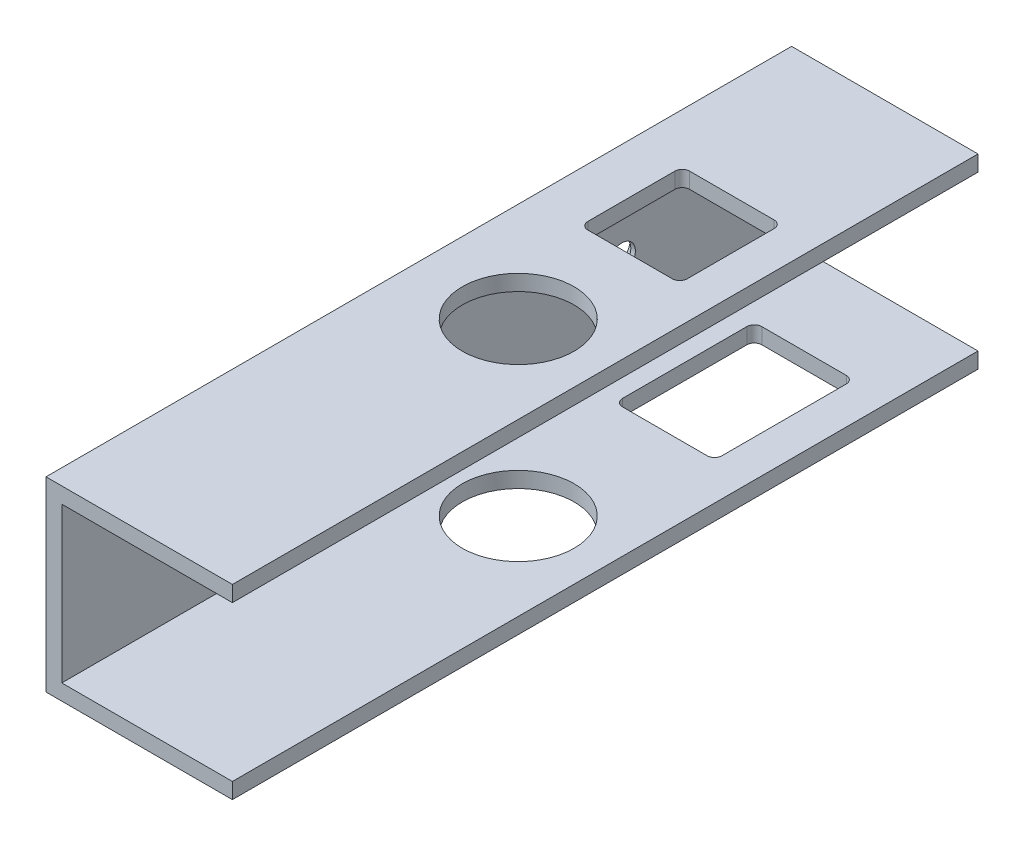
ISO-10303-21;
HEADER;
FILE_DESCRIPTION(('STEP AP214'),'2;1');
FILE_NAME('part.step','',(''),(''),'','','');
FILE_SCHEMA(('AUTOMOTIVE_DESIGN { 1 0 10303 214 1 1 1 1 }'));
ENDSEC;
DATA;
#1=APPLICATION_CONTEXT('core data for automotive mechanical design processes');
#2=APPLICATION_PROTOCOL_DEFINITION('international standard','automotive_design',2000,#1);
#3=PRODUCT_CONTEXT('',#1,'mechanical');
#4=PRODUCT('Part','Part','',(#3));
#5=PRODUCT_RELATED_PRODUCT_CATEGORY('part','',(#4));
#6=PRODUCT_DEFINITION_FORMATION('','',#4);
#7=PRODUCT_DEFINITION_CONTEXT('part definition',#1,'design');
#8=PRODUCT_DEFINITION('design','',#6,#7);
#9=PRODUCT_DEFINITION_SHAPE('','',#8);
#10=(LENGTH_UNIT() NAMED_UNIT(*) SI_UNIT(.MILLI.,.METRE.));
#11=(NAMED_UNIT(*) PLANE_ANGLE_UNIT() SI_UNIT($,.RADIAN.));
#12=(NAMED_UNIT(*) SI_UNIT($,.STERADIAN.) SOLID_ANGLE_UNIT());
#13=UNCERTAINTY_MEASURE_WITH_UNIT(LENGTH_MEASURE(1.E-05),#10,'distance_accuracy_value','');
#14=(GEOMETRIC_REPRESENTATION_CONTEXT(3) GLOBAL_UNCERTAINTY_ASSIGNED_CONTEXT((#13)) GLOBAL_UNIT_ASSIGNED_CONTEXT((#10,
#11,#12)) REPRESENTATION_CONTEXT('',''));
#15=CARTESIAN_POINT('',(0.,0.,0.));
#16=DIRECTION('',(0.,0.,1.));
#17=DIRECTION('',(1.,0.,0.));
#18=AXIS2_PLACEMENT_3D('',#15,#16,#17);
#19=CARTESIAN_POINT('',(75.,-37.5,300.));
#20=DIRECTION('',(0.,1.,0.));
#21=DIRECTION('',(0.,0.,1.));
#22=AXIS2_PLACEMENT_3D('',#19,#20,#21);
#23=PLANE('',#22);
#24=DIRECTION('',(0.,0.,-1.));
#25=VECTOR('',#24,1.);
#26=CARTESIAN_POINT('',(20.,-37.5,91.));
#27=LINE('',#26,#25);
#28=CARTESIAN_POINT('',(20.,-37.5,88.));
#29=VERTEX_POINT('',#28);
#30=CARTESIAN_POINT('',(20.,-37.5,38.));
#31=VERTEX_POINT('',#30);
#32=EDGE_CURVE('E335',#29,#31,#27,.T.);
#33=ORIENTED_EDGE('',*,*,#32,.F.);
#34=CARTESIAN_POINT('',(23.,-37.5,88.));
#35=DIRECTION('',(0.,1.,0.));
#36=DIRECTION('',(0.,0.,1.));
#37=AXIS2_PLACEMENT_3D('',#34,#35,#36);
#38=CIRCLE('',#37,3.);
#39=CARTESIAN_POINT('',(23.,-37.5,91.));
#40=VERTEX_POINT('',#39);
#41=EDGE_CURVE('E286',#29,#40,#38,.T.);
#42=ORIENTED_EDGE('',*,*,#41,.T.);
#43=DIRECTION('',(-1.,0.,0.));
#44=VECTOR('',#43,1.);
#45=CARTESIAN_POINT('',(20.,-37.5,91.));
#46=LINE('',#45,#44);
#47=CARTESIAN_POINT('',(57.,-37.5,91.));
#48=VERTEX_POINT('',#47);
#49=EDGE_CURVE('E332',#48,#40,#46,.T.);
#50=ORIENTED_EDGE('',*,*,#49,.F.);
#51=CARTESIAN_POINT('',(57.,-37.5,88.));
#52=DIRECTION('',(0.,1.,0.));
#53=DIRECTION('',(0.,0.,1.));
#54=AXIS2_PLACEMENT_3D('',#51,#52,#53);
#55=CIRCLE('',#54,3.);
#56=CARTESIAN_POINT('',(60.,-37.5,88.));
#57=VERTEX_POINT('',#56);
#58=EDGE_CURVE('E282',#48,#57,#55,.T.);
#59=ORIENTED_EDGE('',*,*,#58,.T.);
#60=DIRECTION('',(0.,0.,1.));
#61=VECTOR('',#60,1.);
#62=CARTESIAN_POINT('',(60.,-37.5,91.));
#63=LINE('',#62,#61);
#64=CARTESIAN_POINT('',(60.,-37.5,38.));
#65=VERTEX_POINT('',#64);
#66=EDGE_CURVE('E346',#65,#57,#63,.T.);
#67=ORIENTED_EDGE('',*,*,#66,.F.);
#68=CARTESIAN_POINT('',(57.,-37.5,38.));
#69=DIRECTION('',(0.,1.,0.));
#70=DIRECTION('',(0.,0.,1.));
#71=AXIS2_PLACEMENT_3D('',#68,#69,#70);
#72=CIRCLE('',#71,3.);
#73=CARTESIAN_POINT('',(57.,-37.5,35.));
#74=VERTEX_POINT('',#73);
#75=EDGE_CURVE('E278',#65,#74,#72,.T.);
#76=ORIENTED_EDGE('',*,*,#75,.T.);
#77=DIRECTION('',(1.,0.,0.));
#78=VECTOR('',#77,1.);
#79=CARTESIAN_POINT('',(20.,-37.5,35.));
#80=LINE('',#79,#78);
#81=CARTESIAN_POINT('',(23.,-37.5,35.));
#82=VERTEX_POINT('',#81);
#83=EDGE_CURVE('E343',#82,#74,#80,.T.);
#84=ORIENTED_EDGE('',*,*,#83,.F.);
#85=CARTESIAN_POINT('',(23.,-37.5,38.));
#86=DIRECTION('',(0.,1.,0.));
#87=DIRECTION('',(0.,0.,1.));
#88=AXIS2_PLACEMENT_3D('',#85,#86,#87);
#89=CIRCLE('',#88,3.);
#90=EDGE_CURVE('E290',#82,#31,#89,.T.);
#91=ORIENTED_EDGE('',*,*,#90,.T.);
#92=EDGE_LOOP('',(#33,#42,#50,#59,#67,#76,#84,#91));
#93=FACE_BOUND('',#92,.T.);
#94=CARTESIAN_POINT('',(40.,-37.5,150.));
#95=DIRECTION('',(0.,1.,0.));
#96=DIRECTION('',(0.,0.,1.));
#97=AXIS2_PLACEMENT_3D('',#94,#95,#96);
#98=CIRCLE('',#97,22.5);
#99=CARTESIAN_POINT('',(40.,-37.5,172.5));
#100=VERTEX_POINT('',#99);
#101=EDGE_CURVE('E350',#100,#100,#98,.T.);
#102=ORIENTED_EDGE('',*,*,#101,.T.);
#103=EDGE_LOOP('',(#102));
#104=FACE_BOUND('',#103,.T.);
#105=DIRECTION('',(1.,0.,0.));
#106=VECTOR('',#105,1.);
#107=CARTESIAN_POINT('',(75.,-37.5,0.));
#108=LINE('',#107,#106);
#109=CARTESIAN_POINT('',(0.,-37.5,0.));
#110=VERTEX_POINT('',#109);
#111=CARTESIAN_POINT('',(75.,-37.5,0.));
#112=VERTEX_POINT('',#111);
#113=EDGE_CURVE('E221',#110,#112,#108,.T.);
#114=ORIENTED_EDGE('',*,*,#113,.T.);
#115=DIRECTION('',(0.,0.,-1.));
#116=VECTOR('',#115,1.);
#117=CARTESIAN_POINT('',(75.,-37.5,300.));
#118=LINE('',#117,#116);
#119=CARTESIAN_POINT('',(75.,-37.5,300.));
#120=VERTEX_POINT('',#119);
#121=EDGE_CURVE('E202',#120,#112,#118,.T.);
#122=ORIENTED_EDGE('',*,*,#121,.F.);
#123=DIRECTION('',(1.,0.,0.));
#124=VECTOR('',#123,1.);
#125=CARTESIAN_POINT('',(75.,-37.5,300.));
#126=LINE('',#125,#124);
#127=CARTESIAN_POINT('',(0.,-37.5,300.));
#128=VERTEX_POINT('',#127);
#129=EDGE_CURVE('E209',#128,#120,#126,.T.);
#130=ORIENTED_EDGE('',*,*,#129,.F.);
#131=DIRECTION('',(0.,0.,-1.));
#132=VECTOR('',#131,1.);
#133=CARTESIAN_POINT('',(0.,-37.5,300.));
#134=LINE('',#133,#132);
#135=EDGE_CURVE('E371',#128,#110,#134,.T.);
#136=ORIENTED_EDGE('',*,*,#135,.T.);
#137=EDGE_LOOP('',(#114,#122,#130,#136));
#138=FACE_BOUND('',#137,.T.);
#139=ADVANCED_FACE('F35',(#93,#104,#138),#23,.F.);
#140=CARTESIAN_POINT('',(75.,-31.15,300.));
#141=DIRECTION('',(-1.,0.,0.));
#142=DIRECTION('',(0.,-1.,0.));
#143=AXIS2_PLACEMENT_3D('',#140,#141,#142);
#144=PLANE('',#143);
#145=DIRECTION('',(0.,1.,0.));
#146=VECTOR('',#145,1.);
#147=CARTESIAN_POINT('',(75.,-31.15,0.));
#148=LINE('',#147,#146);
#149=CARTESIAN_POINT('',(75.,-31.15,0.));
#150=VERTEX_POINT('',#149);
#151=EDGE_CURVE('E373',#112,#150,#148,.T.);
#152=ORIENTED_EDGE('',*,*,#151,.T.);
#153=DIRECTION('',(0.,0.,-1.));
#154=VECTOR('',#153,1.);
#155=CARTESIAN_POINT('',(75.,-31.15,300.));
#156=LINE('',#155,#154);
#157=CARTESIAN_POINT('',(75.,-31.15,300.));
#158=VERTEX_POINT('',#157);
#159=EDGE_CURVE('E205',#158,#150,#156,.T.);
#160=ORIENTED_EDGE('',*,*,#159,.F.);
#161=DIRECTION('',(0.,1.,0.));
#162=VECTOR('',#161,1.);
#163=CARTESIAN_POINT('',(75.,-31.15,300.));
#164=LINE('',#163,#162);
#165=EDGE_CURVE('E198',#120,#158,#164,.T.);
#166=ORIENTED_EDGE('',*,*,#165,.F.);
#167=ORIENTED_EDGE('',*,*,#121,.T.);
#168=EDGE_LOOP('',(#152,#160,#166,#167));
#169=FACE_BOUND('',#168,.T.);
#170=ADVANCED_FACE('F200',(#169),#144,.F.);
#171=CARTESIAN_POINT('',(6.35000000000001,-31.15,300.));
#172=DIRECTION('',(0.,-1.,0.));
#173=DIRECTION('',(0.,0.,-1.));
#174=AXIS2_PLACEMENT_3D('',#171,#172,#173);
#175=PLANE('',#174);
#176=DIRECTION('',(1.,0.,0.));
#177=VECTOR('',#176,1.);
#178=CARTESIAN_POINT('',(6.35000000000001,-31.15,35.));
#179=LINE('',#178,#177);
#180=CARTESIAN_POINT('',(23.,-31.15,35.));
#181=VERTEX_POINT('',#180);
#182=CARTESIAN_POINT('',(57.,-31.15,35.));
#183=VERTEX_POINT('',#182);
#184=EDGE_CURVE('E225',#181,#183,#179,.T.);
#185=ORIENTED_EDGE('',*,*,#184,.T.);
#186=CARTESIAN_POINT('',(57.,-31.15,38.));
#187=DIRECTION('',(0.,-1.,0.));
#188=DIRECTION('',(0.,0.,-1.));
#189=AXIS2_PLACEMENT_3D('',#186,#187,#188);
#190=CIRCLE('',#189,3.);
#191=CARTESIAN_POINT('',(60.,-31.15,38.));
#192=VERTEX_POINT('',#191);
#193=EDGE_CURVE('E280',#183,#192,#190,.T.);
#194=ORIENTED_EDGE('',*,*,#193,.T.);
#195=DIRECTION('',(0.,0.,1.));
#196=VECTOR('',#195,1.);
#197=CARTESIAN_POINT('',(59.9999999999999,-31.15,300.));
#198=LINE('',#197,#196);
#199=CARTESIAN_POINT('',(60.,-31.15,88.));
#200=VERTEX_POINT('',#199);
#201=EDGE_CURVE('E233',#192,#200,#198,.T.);
#202=ORIENTED_EDGE('',*,*,#201,.T.);
#203=CARTESIAN_POINT('',(57.,-31.15,88.));
#204=DIRECTION('',(0.,-1.,0.));
#205=DIRECTION('',(0.,0.,-1.));
#206=AXIS2_PLACEMENT_3D('',#203,#204,#205);
#207=CIRCLE('',#206,3.);
#208=CARTESIAN_POINT('',(57.,-31.15,91.));
#209=VERTEX_POINT('',#208);
#210=EDGE_CURVE('E284',#200,#209,#207,.T.);
#211=ORIENTED_EDGE('',*,*,#210,.T.);
#212=DIRECTION('',(-1.,0.,0.));
#213=VECTOR('',#212,1.);
#214=CARTESIAN_POINT('',(6.35000000000001,-31.15,91.));
#215=LINE('',#214,#213);
#216=CARTESIAN_POINT('',(23.,-31.15,91.));
#217=VERTEX_POINT('',#216);
#218=EDGE_CURVE('E236',#209,#217,#215,.T.);
#219=ORIENTED_EDGE('',*,*,#218,.T.);
#220=CARTESIAN_POINT('',(23.,-31.15,88.));
#221=DIRECTION('',(0.,-1.,0.));
#222=DIRECTION('',(0.,0.,-1.));
#223=AXIS2_PLACEMENT_3D('',#220,#221,#222);
#224=CIRCLE('',#223,3.);
#225=CARTESIAN_POINT('',(20.,-31.15,88.));
#226=VERTEX_POINT('',#225);
#227=EDGE_CURVE('E288',#217,#226,#224,.T.);
#228=ORIENTED_EDGE('',*,*,#227,.T.);
#229=DIRECTION('',(0.,0.,-1.));
#230=VECTOR('',#229,1.);
#231=CARTESIAN_POINT('',(20.0000000000001,-31.15,300.));
#232=LINE('',#231,#230);
#233=CARTESIAN_POINT('',(20.,-31.15,38.));
#234=VERTEX_POINT('',#233);
#235=EDGE_CURVE('E222',#226,#234,#232,.T.);
#236=ORIENTED_EDGE('',*,*,#235,.T.);
#237=CARTESIAN_POINT('',(23.,-31.15,38.));
#238=DIRECTION('',(0.,-1.,0.));
#239=DIRECTION('',(0.,0.,-1.));
#240=AXIS2_PLACEMENT_3D('',#237,#238,#239);
#241=CIRCLE('',#240,3.);
#242=EDGE_CURVE('E292',#234,#181,#241,.T.);
#243=ORIENTED_EDGE('',*,*,#242,.T.);
#244=EDGE_LOOP('',(#185,#194,#202,#211,#219,#228,#236,#243));
#245=FACE_BOUND('',#244,.T.);
#246=CARTESIAN_POINT('',(40.,-31.15,150.));
#247=DIRECTION('',(0.,-1.,0.));
#248=DIRECTION('',(0.,0.,-1.));
#249=AXIS2_PLACEMENT_3D('',#246,#247,#248);
#250=CIRCLE('',#249,22.5);
#251=CARTESIAN_POINT('',(40.,-31.15,127.5));
#252=VERTEX_POINT('',#251);
#253=EDGE_CURVE('E358',#252,#252,#250,.T.);
#254=ORIENTED_EDGE('',*,*,#253,.T.);
#255=EDGE_LOOP('',(#254));
#256=FACE_BOUND('',#255,.T.);
#257=DIRECTION('',(-1.,0.,0.));
#258=VECTOR('',#257,1.);
#259=CARTESIAN_POINT('',(6.35000000000001,-31.15,0.));
#260=LINE('',#259,#258);
#261=CARTESIAN_POINT('',(6.35000000000001,-31.15,0.));
#262=VERTEX_POINT('',#261);
#263=EDGE_CURVE('E375',#150,#262,#260,.T.);
#264=ORIENTED_EDGE('',*,*,#263,.T.);
#265=DIRECTION('',(0.,0.,-1.));
#266=VECTOR('',#265,1.);
#267=CARTESIAN_POINT('',(6.35000000000001,-31.15,300.));
#268=LINE('',#267,#266);
#269=CARTESIAN_POINT('',(6.35000000000001,-31.15,300.));
#270=VERTEX_POINT('',#269);
#271=EDGE_CURVE('E227',#270,#262,#268,.T.);
#272=ORIENTED_EDGE('',*,*,#271,.F.);
#273=DIRECTION('',(-1.,0.,0.));
#274=VECTOR('',#273,1.);
#275=CARTESIAN_POINT('',(6.35000000000001,-31.15,300.));
#276=LINE('',#275,#274);
#277=EDGE_CURVE('E208',#158,#270,#276,.T.);
#278=ORIENTED_EDGE('',*,*,#277,.F.);
#279=ORIENTED_EDGE('',*,*,#159,.T.);
#280=EDGE_LOOP('',(#264,#272,#278,#279));
#281=FACE_BOUND('',#280,.T.);
#282=ADVANCED_FACE('F421',(#245,#256,#281),#175,.F.);
#283=CARTESIAN_POINT('',(6.35000000000001,31.15,300.));
#284=DIRECTION('',(-1.,0.,0.));
#285=DIRECTION('',(0.,0.,1.));
#286=AXIS2_PLACEMENT_3D('',#283,#284,#285);
#287=PLANE('',#286);
#288=CARTESIAN_POINT('',(6.35000000000001,4.01110333021214,74.7041216047486));
#289=DIRECTION('',(-1.,0.,0.));
#290=DIRECTION('',(0.,0.,1.));
#291=AXIS2_PLACEMENT_3D('',#288,#289,#290);
#292=CIRCLE('',#291,5.49999999999999);
#293=CARTESIAN_POINT('',(6.35000000000001,4.01110333021214,80.2041216047486));
#294=VERTEX_POINT('',#293);
#295=EDGE_CURVE('E39',#294,#294,#292,.T.);
#296=ORIENTED_EDGE('',*,*,#295,.T.);
#297=EDGE_LOOP('',(#296));
#298=FACE_BOUND('',#297,.T.);
#299=DIRECTION('',(0.,1.,0.));
#300=VECTOR('',#299,1.);
#301=CARTESIAN_POINT('',(6.35000000000001,31.15,0.));
#302=LINE('',#301,#300);
#303=CARTESIAN_POINT('',(6.35000000000001,31.15,0.));
#304=VERTEX_POINT('',#303);
#305=EDGE_CURVE('E377',#262,#304,#302,.T.);
#306=ORIENTED_EDGE('',*,*,#305,.T.);
#307=DIRECTION('',(0.,0.,-1.));
#308=VECTOR('',#307,1.);
#309=CARTESIAN_POINT('',(6.35000000000001,31.15,300.));
#310=LINE('',#309,#308);
#311=CARTESIAN_POINT('',(6.35000000000001,31.15,300.));
#312=VERTEX_POINT('',#311);
#313=EDGE_CURVE('E396',#312,#304,#310,.T.);
#314=ORIENTED_EDGE('',*,*,#313,.F.);
#315=DIRECTION('',(0.,1.,0.));
#316=VECTOR('',#315,1.);
#317=CARTESIAN_POINT('',(6.35000000000001,31.15,300.));
#318=LINE('',#317,#316);
#319=EDGE_CURVE('E362',#270,#312,#318,.T.);
#320=ORIENTED_EDGE('',*,*,#319,.F.);
#321=ORIENTED_EDGE('',*,*,#271,.T.);
#322=EDGE_LOOP('',(#306,#314,#320,#321));
#323=FACE_BOUND('',#322,.T.);
#324=ADVANCED_FACE('F403',(#298,#323),#287,.F.);
#325=CARTESIAN_POINT('',(75.,31.15,300.));
#326=DIRECTION('',(0.,1.,0.));
#327=DIRECTION('',(0.,0.,1.));
#328=AXIS2_PLACEMENT_3D('',#325,#326,#327);
#329=PLANE('',#328);
#330=DIRECTION('',(-1.,0.,0.));
#331=VECTOR('',#330,1.);
#332=CARTESIAN_POINT('',(75.,31.15,64.));
#333=LINE('',#332,#331);
#334=CARTESIAN_POINT('',(57.,31.15,64.));
#335=VERTEX_POINT('',#334);
#336=CARTESIAN_POINT('',(23.,31.15,64.));
#337=VERTEX_POINT('',#336);
#338=EDGE_CURVE('E337',#335,#337,#333,.T.);
#339=ORIENTED_EDGE('',*,*,#338,.T.);
#340=CARTESIAN_POINT('',(23.,31.15,67.));
#341=DIRECTION('',(0.,1.,0.));
#342=DIRECTION('',(0.,0.,1.));
#343=AXIS2_PLACEMENT_3D('',#340,#341,#342);
#344=CIRCLE('',#343,3.);
#345=CARTESIAN_POINT('',(20.,31.15,67.));
#346=VERTEX_POINT('',#345);
#347=EDGE_CURVE('E58',#337,#346,#344,.T.);
#348=ORIENTED_EDGE('',*,*,#347,.T.);
#349=DIRECTION('',(0.,0.,1.));
#350=VECTOR('',#349,1.);
#351=CARTESIAN_POINT('',(20.,31.15,300.));
#352=LINE('',#351,#350);
#353=CARTESIAN_POINT('',(20.,31.15,102.));
#354=VERTEX_POINT('',#353);
#355=EDGE_CURVE('E328',#346,#354,#352,.T.);
#356=ORIENTED_EDGE('',*,*,#355,.T.);
#357=CARTESIAN_POINT('',(23.,31.15,102.));
#358=DIRECTION('',(0.,1.,0.));
#359=DIRECTION('',(0.,0.,1.));
#360=AXIS2_PLACEMENT_3D('',#357,#358,#359);
#361=CIRCLE('',#360,3.);
#362=CARTESIAN_POINT('',(23.,31.15,105.));
#363=VERTEX_POINT('',#362);
#364=EDGE_CURVE('E11',#354,#363,#361,.T.);
#365=ORIENTED_EDGE('',*,*,#364,.T.);
#366=DIRECTION('',(1.,0.,0.));
#367=VECTOR('',#366,1.);
#368=CARTESIAN_POINT('',(75.,31.15,105.));
#369=LINE('',#368,#367);
#370=CARTESIAN_POINT('',(57.,31.15,105.));
#371=VERTEX_POINT('',#370);
#372=EDGE_CURVE('E326',#363,#371,#369,.T.);
#373=ORIENTED_EDGE('',*,*,#372,.T.);
#374=CARTESIAN_POINT('',(57.,31.15,102.));
#375=DIRECTION('',(0.,1.,0.));
#376=DIRECTION('',(0.,0.,1.));
#377=AXIS2_PLACEMENT_3D('',#374,#375,#376);
#378=CIRCLE('',#377,3.);
#379=CARTESIAN_POINT('',(60.,31.15,102.));
#380=VERTEX_POINT('',#379);
#381=EDGE_CURVE('E296',#371,#380,#378,.T.);
#382=ORIENTED_EDGE('',*,*,#381,.T.);
#383=DIRECTION('',(0.,0.,-1.));
#384=VECTOR('',#383,1.);
#385=CARTESIAN_POINT('',(60.,31.15,300.));
#386=LINE('',#385,#384);
#387=CARTESIAN_POINT('',(60.,31.15,67.));
#388=VERTEX_POINT('',#387);
#389=EDGE_CURVE('E318',#380,#388,#386,.T.);
#390=ORIENTED_EDGE('',*,*,#389,.T.);
#391=CARTESIAN_POINT('',(57.,31.15,67.));
#392=DIRECTION('',(0.,1.,0.));
#393=DIRECTION('',(0.,0.,1.));
#394=AXIS2_PLACEMENT_3D('',#391,#392,#393);
#395=CIRCLE('',#394,3.);
#396=EDGE_CURVE('E300',#388,#335,#395,.T.);
#397=ORIENTED_EDGE('',*,*,#396,.T.);
#398=EDGE_LOOP('',(#339,#348,#356,#365,#373,#382,#390,#397));
#399=FACE_BOUND('',#398,.T.);
#400=CARTESIAN_POINT('',(40.,31.15,150.));
#401=DIRECTION('',(0.,1.,0.));
#402=DIRECTION('',(0.,0.,1.));
#403=AXIS2_PLACEMENT_3D('',#400,#401,#402);
#404=CIRCLE('',#403,22.5);
#405=CARTESIAN_POINT('',(40.,31.15,172.5));
#406=VERTEX_POINT('',#405);
#407=EDGE_CURVE('E353',#406,#406,#404,.T.);
#408=ORIENTED_EDGE('',*,*,#407,.T.);
#409=EDGE_LOOP('',(#408));
#410=FACE_BOUND('',#409,.T.);
#411=DIRECTION('',(1.,0.,0.));
#412=VECTOR('',#411,1.);
#413=CARTESIAN_POINT('',(75.,31.15,0.));
#414=LINE('',#413,#412);
#415=CARTESIAN_POINT('',(75.,31.15,0.));
#416=VERTEX_POINT('',#415);
#417=EDGE_CURVE('E379',#304,#416,#414,.T.);
#418=ORIENTED_EDGE('',*,*,#417,.T.);
#419=DIRECTION('',(0.,0.,-1.));
#420=VECTOR('',#419,1.);
#421=CARTESIAN_POINT('',(75.,31.15,300.));
#422=LINE('',#421,#420);
#423=CARTESIAN_POINT('',(75.,31.15,300.));
#424=VERTEX_POINT('',#423);
#425=EDGE_CURVE('E393',#424,#416,#422,.T.);
#426=ORIENTED_EDGE('',*,*,#425,.F.);
#427=DIRECTION('',(1.,0.,0.));
#428=VECTOR('',#427,1.);
#429=CARTESIAN_POINT('',(75.,31.15,300.));
#430=LINE('',#429,#428);
#431=EDGE_CURVE('E364',#312,#424,#430,.T.);
#432=ORIENTED_EDGE('',*,*,#431,.F.);
#433=ORIENTED_EDGE('',*,*,#313,.T.);
#434=EDGE_LOOP('',(#418,#426,#432,#433));
#435=FACE_BOUND('',#434,.T.);
#436=ADVANCED_FACE('F324',(#399,#410,#435),#329,.F.);
#437=CARTESIAN_POINT('',(75.,37.5,300.));
#438=DIRECTION('',(-1.,0.,0.));
#439=DIRECTION('',(0.,-1.,0.));
#440=AXIS2_PLACEMENT_3D('',#437,#438,#439);
#441=PLANE('',#440);
#442=DIRECTION('',(0.,1.,0.));
#443=VECTOR('',#442,1.);
#444=CARTESIAN_POINT('',(75.,37.5,0.));
#445=LINE('',#444,#443);
#446=CARTESIAN_POINT('',(75.,37.5,0.));
#447=VERTEX_POINT('',#446);
#448=EDGE_CURVE('E381',#416,#447,#445,.T.);
#449=ORIENTED_EDGE('',*,*,#448,.T.);
#450=DIRECTION('',(0.,0.,-1.));
#451=VECTOR('',#450,1.);
#452=CARTESIAN_POINT('',(75.,37.5,300.));
#453=LINE('',#452,#451);
#454=CARTESIAN_POINT('',(75.,37.5,300.));
#455=VERTEX_POINT('',#454);
#456=EDGE_CURVE('E390',#455,#447,#453,.T.);
#457=ORIENTED_EDGE('',*,*,#456,.F.);
#458=DIRECTION('',(0.,1.,0.));
#459=VECTOR('',#458,1.);
#460=CARTESIAN_POINT('',(75.,37.5,300.));
#461=LINE('',#460,#459);
#462=EDGE_CURVE('E366',#424,#455,#461,.T.);
#463=ORIENTED_EDGE('',*,*,#462,.F.);
#464=ORIENTED_EDGE('',*,*,#425,.T.);
#465=EDGE_LOOP('',(#449,#457,#463,#464));
#466=FACE_BOUND('',#465,.T.);
#467=ADVANCED_FACE('F417',(#466),#441,.F.);
#468=CARTESIAN_POINT('',(0.,37.5,300.));
#469=DIRECTION('',(0.,-1.,0.));
#470=DIRECTION('',(0.,0.,-1.));
#471=AXIS2_PLACEMENT_3D('',#468,#469,#470);
#472=PLANE('',#471);
#473=DIRECTION('',(0.,0.,-1.));
#474=VECTOR('',#473,1.);
#475=CARTESIAN_POINT('',(60.,37.5,105.));
#476=LINE('',#475,#474);
#477=CARTESIAN_POINT('',(60.,37.5,102.));
#478=VERTEX_POINT('',#477);
#479=CARTESIAN_POINT('',(60.,37.5,67.));
#480=VERTEX_POINT('',#479);
#481=EDGE_CURVE('E481',#478,#480,#476,.T.);
#482=ORIENTED_EDGE('',*,*,#481,.F.);
#483=CARTESIAN_POINT('',(57.,37.5,102.));
#484=DIRECTION('',(0.,-1.,0.));
#485=DIRECTION('',(0.,0.,-1.));
#486=AXIS2_PLACEMENT_3D('',#483,#484,#485);
#487=CIRCLE('',#486,3.);
#488=CARTESIAN_POINT('',(57.,37.5,105.));
#489=VERTEX_POINT('',#488);
#490=EDGE_CURVE('E294',#478,#489,#487,.T.);
#491=ORIENTED_EDGE('',*,*,#490,.T.);
#492=DIRECTION('',(1.,0.,0.));
#493=VECTOR('',#492,1.);
#494=CARTESIAN_POINT('',(60.,37.5,105.));
#495=LINE('',#494,#493);
#496=CARTESIAN_POINT('',(23.,37.5,105.));
#497=VERTEX_POINT('',#496);
#498=EDGE_CURVE('E313',#497,#489,#495,.T.);
#499=ORIENTED_EDGE('',*,*,#498,.F.);
#500=CARTESIAN_POINT('',(23.,37.5,102.));
#501=DIRECTION('',(0.,-1.,0.));
#502=DIRECTION('',(0.,0.,-1.));
#503=AXIS2_PLACEMENT_3D('',#500,#501,#502);
#504=CIRCLE('',#503,3.);
#505=CARTESIAN_POINT('',(20.,37.5,102.));
#506=VERTEX_POINT('',#505);
#507=EDGE_CURVE('E44',#497,#506,#504,.T.);
#508=ORIENTED_EDGE('',*,*,#507,.T.);
#509=DIRECTION('',(0.,0.,1.));
#510=VECTOR('',#509,1.);
#511=CARTESIAN_POINT('',(20.,37.5,105.));
#512=LINE('',#511,#510);
#513=CARTESIAN_POINT('',(20.,37.5,67.));
#514=VERTEX_POINT('',#513);
#515=EDGE_CURVE('E311',#514,#506,#512,.T.);
#516=ORIENTED_EDGE('',*,*,#515,.F.);
#517=CARTESIAN_POINT('',(23.,37.5,67.));
#518=DIRECTION('',(0.,-1.,0.));
#519=DIRECTION('',(0.,0.,-1.));
#520=AXIS2_PLACEMENT_3D('',#517,#518,#519);
#521=CIRCLE('',#520,3.);
#522=CARTESIAN_POINT('',(23.,37.5,64.));
#523=VERTEX_POINT('',#522);
#524=EDGE_CURVE('E302',#514,#523,#521,.T.);
#525=ORIENTED_EDGE('',*,*,#524,.T.);
#526=DIRECTION('',(-1.,0.,0.));
#527=VECTOR('',#526,1.);
#528=CARTESIAN_POINT('',(60.,37.5,64.));
#529=LINE('',#528,#527);
#530=CARTESIAN_POINT('',(57.,37.5,64.));
#531=VERTEX_POINT('',#530);
#532=EDGE_CURVE('E319',#531,#523,#529,.T.);
#533=ORIENTED_EDGE('',*,*,#532,.F.);
#534=CARTESIAN_POINT('',(57.,37.5,67.));
#535=DIRECTION('',(0.,-1.,0.));
#536=DIRECTION('',(0.,0.,-1.));
#537=AXIS2_PLACEMENT_3D('',#534,#535,#536);
#538=CIRCLE('',#537,3.);
#539=EDGE_CURVE('E298',#531,#480,#538,.T.);
#540=ORIENTED_EDGE('',*,*,#539,.T.);
#541=EDGE_LOOP('',(#482,#491,#499,#508,#516,#525,#533,#540));
#542=FACE_BOUND('',#541,.T.);
#543=CARTESIAN_POINT('',(40.,37.5,150.));
#544=DIRECTION('',(0.,1.,0.));
#545=DIRECTION('',(0.,0.,1.));
#546=AXIS2_PLACEMENT_3D('',#543,#544,#545);
#547=CIRCLE('',#546,22.5);
#548=CARTESIAN_POINT('',(40.,37.5,172.5));
#549=VERTEX_POINT('',#548);
#550=EDGE_CURVE('E349',#549,#549,#547,.T.);
#551=ORIENTED_EDGE('',*,*,#550,.F.);
#552=EDGE_LOOP('',(#551));
#553=FACE_BOUND('',#552,.T.);
#554=DIRECTION('',(-1.,0.,0.));
#555=VECTOR('',#554,1.);
#556=CARTESIAN_POINT('',(0.,37.5,0.));
#557=LINE('',#556,#555);
#558=CARTESIAN_POINT('',(0.,37.5,0.));
#559=VERTEX_POINT('',#558);
#560=EDGE_CURVE('E383',#447,#559,#557,.T.);
#561=ORIENTED_EDGE('',*,*,#560,.T.);
#562=DIRECTION('',(0.,0.,-1.));
#563=VECTOR('',#562,1.);
#564=CARTESIAN_POINT('',(0.,37.5,300.));
#565=LINE('',#564,#563);
#566=CARTESIAN_POINT('',(0.,37.5,300.));
#567=VERTEX_POINT('',#566);
#568=EDGE_CURVE('E387',#567,#559,#565,.T.);
#569=ORIENTED_EDGE('',*,*,#568,.F.);
#570=DIRECTION('',(-1.,0.,0.));
#571=VECTOR('',#570,1.);
#572=CARTESIAN_POINT('',(0.,37.5,300.));
#573=LINE('',#572,#571);
#574=EDGE_CURVE('E368',#455,#567,#573,.T.);
#575=ORIENTED_EDGE('',*,*,#574,.F.);
#576=ORIENTED_EDGE('',*,*,#456,.T.);
#577=EDGE_LOOP('',(#561,#569,#575,#576));
#578=FACE_BOUND('',#577,.T.);
#579=ADVANCED_FACE('F309',(#542,#553,#578),#472,.F.);
#580=CARTESIAN_POINT('',(0.,-37.5,300.));
#581=DIRECTION('',(1.,0.,0.));
#582=DIRECTION('',(0.,0.,-1.));
#583=AXIS2_PLACEMENT_3D('',#580,#581,#582);
#584=PLANE('',#583);
#585=CARTESIAN_POINT('',(0.,4.01110333021214,74.7041216047486));
#586=DIRECTION('',(-1.,0.,0.));
#587=DIRECTION('',(0.,0.,1.));
#588=AXIS2_PLACEMENT_3D('',#585,#586,#587);
#589=CIRCLE('',#588,10.);
#590=CARTESIAN_POINT('',(0.,4.01110333021214,84.7041216047486));
#591=VERTEX_POINT('',#590);
#592=EDGE_CURVE('E498',#591,#591,#589,.T.);
#593=ORIENTED_EDGE('',*,*,#592,.F.);
#594=EDGE_LOOP('',(#593));
#595=FACE_BOUND('',#594,.T.);
#596=DIRECTION('',(0.,-1.,0.));
#597=VECTOR('',#596,1.);
#598=CARTESIAN_POINT('',(0.,-37.5,0.));
#599=LINE('',#598,#597);
#600=EDGE_CURVE('E218',#559,#110,#599,.T.);
#601=ORIENTED_EDGE('',*,*,#600,.T.);
#602=ORIENTED_EDGE('',*,*,#135,.F.);
#603=DIRECTION('',(0.,-1.,0.));
#604=VECTOR('',#603,1.);
#605=CARTESIAN_POINT('',(0.,-37.5,300.));
#606=LINE('',#605,#604);
#607=EDGE_CURVE('E214',#567,#128,#606,.T.);
#608=ORIENTED_EDGE('',*,*,#607,.F.);
#609=ORIENTED_EDGE('',*,*,#568,.T.);
#610=EDGE_LOOP('',(#601,#602,#608,#609));
#611=FACE_BOUND('',#610,.T.);
#612=ADVANCED_FACE('F504',(#595,#611),#584,.F.);
#613=CARTESIAN_POINT('',(0.,0.,300.));
#614=DIRECTION('',(0.,0.,-1.));
#615=DIRECTION('',(-1.,0.,0.));
#616=AXIS2_PLACEMENT_3D('',#613,#614,#615);
#617=PLANE('',#616);
#618=ORIENTED_EDGE('',*,*,#129,.T.);
#619=ORIENTED_EDGE('',*,*,#165,.T.);
#620=ORIENTED_EDGE('',*,*,#277,.T.);
#621=ORIENTED_EDGE('',*,*,#319,.T.);
#622=ORIENTED_EDGE('',*,*,#431,.T.);
#623=ORIENTED_EDGE('',*,*,#462,.T.);
#624=ORIENTED_EDGE('',*,*,#574,.T.);
#625=ORIENTED_EDGE('',*,*,#607,.T.);
#626=EDGE_LOOP('',(#618,#619,#620,#621,#622,#623,#624,#625));
#627=FACE_BOUND('',#626,.T.);
#628=ADVANCED_FACE('F212',(#627),#617,.F.);
#629=CARTESIAN_POINT('',(0.,0.,0.));
#630=DIRECTION('',(0.,0.,-1.));
#631=DIRECTION('',(-1.,0.,0.));
#632=AXIS2_PLACEMENT_3D('',#629,#630,#631);
#633=PLANE('',#632);
#634=ORIENTED_EDGE('',*,*,#113,.F.);
#635=ORIENTED_EDGE('',*,*,#600,.F.);
#636=ORIENTED_EDGE('',*,*,#560,.F.);
#637=ORIENTED_EDGE('',*,*,#448,.F.);
#638=ORIENTED_EDGE('',*,*,#417,.F.);
#639=ORIENTED_EDGE('',*,*,#305,.F.);
#640=ORIENTED_EDGE('',*,*,#263,.F.);
#641=ORIENTED_EDGE('',*,*,#151,.F.);
#642=EDGE_LOOP('',(#634,#635,#636,#637,#638,#639,#640,#641));
#643=FACE_BOUND('',#642,.T.);
#644=ADVANCED_FACE('F409',(#643),#633,.T.);
#645=CARTESIAN_POINT('',(40.,-37.5,150.));
#646=DIRECTION('',(0.,1.,0.));
#647=DIRECTION('',(0.,0.,1.));
#648=AXIS2_PLACEMENT_3D('',#645,#646,#647);
#649=CYLINDRICAL_SURFACE('',#648,22.5);
#650=ORIENTED_EDGE('',*,*,#550,.T.);
#651=EDGE_LOOP('',(#650));
#652=FACE_BOUND('',#651,.T.);
#653=ORIENTED_EDGE('',*,*,#407,.F.);
#654=EDGE_LOOP('',(#653));
#655=FACE_BOUND('',#654,.T.);
#656=ADVANCED_FACE('F554',(#652,#655),#649,.F.);
#657=ORIENTED_EDGE('',*,*,#101,.F.);
#658=EDGE_LOOP('',(#657));
#659=FACE_BOUND('',#658,.T.);
#660=ORIENTED_EDGE('',*,*,#253,.F.);
#661=EDGE_LOOP('',(#660));
#662=FACE_BOUND('',#661,.T.);
#663=ADVANCED_FACE('F560',(#659,#662),#649,.F.);
#664=CARTESIAN_POINT('',(20.,-27.5,91.));
#665=DIRECTION('',(0.,0.,1.));
#666=DIRECTION('',(1.,0.,0.));
#667=AXIS2_PLACEMENT_3D('',#664,#665,#666);
#668=PLANE('',#667);
#669=ORIENTED_EDGE('',*,*,#218,.F.);
#670=DIRECTION('',(0.,-1.,0.));
#671=VECTOR('',#670,1.);
#672=CARTESIAN_POINT('',(57.,-37.5,91.));
#673=LINE('',#672,#671);
#674=EDGE_CURVE('E251',#209,#48,#673,.T.);
#675=ORIENTED_EDGE('',*,*,#674,.T.);
#676=ORIENTED_EDGE('',*,*,#49,.T.);
#677=DIRECTION('',(0.,-1.,0.));
#678=VECTOR('',#677,1.);
#679=CARTESIAN_POINT('',(23.,-31.15,91.));
#680=LINE('',#679,#678);
#681=EDGE_CURVE('E249',#40,#217,#680,.F.);
#682=ORIENTED_EDGE('',*,*,#681,.T.);
#683=EDGE_LOOP('',(#669,#675,#676,#682));
#684=FACE_BOUND('',#683,.T.);
#685=ADVANCED_FACE('F567',(#684),#668,.F.);
#686=CARTESIAN_POINT('',(60.,-27.5,91.));
#687=DIRECTION('',(1.,0.,0.));
#688=DIRECTION('',(0.,0.,-1.));
#689=AXIS2_PLACEMENT_3D('',#686,#687,#688);
#690=PLANE('',#689);
#691=ORIENTED_EDGE('',*,*,#201,.F.);
#692=DIRECTION('',(0.,-1.,0.));
#693=VECTOR('',#692,1.);
#694=CARTESIAN_POINT('',(60.,-37.5,38.));
#695=LINE('',#694,#693);
#696=EDGE_CURVE('E241',#192,#65,#695,.T.);
#697=ORIENTED_EDGE('',*,*,#696,.T.);
#698=ORIENTED_EDGE('',*,*,#66,.T.);
#699=DIRECTION('',(0.,-1.,0.));
#700=VECTOR('',#699,1.);
#701=CARTESIAN_POINT('',(60.,-31.15,88.));
#702=LINE('',#701,#700);
#703=EDGE_CURVE('E239',#57,#200,#702,.F.);
#704=ORIENTED_EDGE('',*,*,#703,.T.);
#705=EDGE_LOOP('',(#691,#697,#698,#704));
#706=FACE_BOUND('',#705,.T.);
#707=ADVANCED_FACE('F573',(#706),#690,.F.);
#708=CARTESIAN_POINT('',(20.,-27.5,35.));
#709=DIRECTION('',(0.,0.,-1.));
#710=DIRECTION('',(-1.,0.,0.));
#711=AXIS2_PLACEMENT_3D('',#708,#709,#710);
#712=PLANE('',#711);
#713=ORIENTED_EDGE('',*,*,#83,.T.);
#714=DIRECTION('',(0.,-1.,0.));
#715=VECTOR('',#714,1.);
#716=CARTESIAN_POINT('',(57.,-31.15,35.));
#717=LINE('',#716,#715);
#718=EDGE_CURVE('E247',#74,#183,#717,.F.);
#719=ORIENTED_EDGE('',*,*,#718,.T.);
#720=ORIENTED_EDGE('',*,*,#184,.F.);
#721=DIRECTION('',(0.,-1.,0.));
#722=VECTOR('',#721,1.);
#723=CARTESIAN_POINT('',(23.,-37.5,35.));
#724=LINE('',#723,#722);
#725=EDGE_CURVE('E244',#181,#82,#724,.T.);
#726=ORIENTED_EDGE('',*,*,#725,.T.);
#727=EDGE_LOOP('',(#713,#719,#720,#726));
#728=FACE_BOUND('',#727,.T.);
#729=ADVANCED_FACE('F581',(#728),#712,.F.);
#730=CARTESIAN_POINT('',(20.,-27.5,91.));
#731=DIRECTION('',(-1.,0.,0.));
#732=DIRECTION('',(0.,0.,1.));
#733=AXIS2_PLACEMENT_3D('',#730,#731,#732);
#734=PLANE('',#733);
#735=ORIENTED_EDGE('',*,*,#235,.F.);
#736=DIRECTION('',(0.,-1.,0.));
#737=VECTOR('',#736,1.);
#738=CARTESIAN_POINT('',(20.,-37.5,88.));
#739=LINE('',#738,#737);
#740=EDGE_CURVE('E256',#226,#29,#739,.T.);
#741=ORIENTED_EDGE('',*,*,#740,.T.);
#742=ORIENTED_EDGE('',*,*,#32,.T.);
#743=DIRECTION('',(0.,-1.,0.));
#744=VECTOR('',#743,1.);
#745=CARTESIAN_POINT('',(20.,-31.15,38.));
#746=LINE('',#745,#744);
#747=EDGE_CURVE('E254',#31,#234,#746,.F.);
#748=ORIENTED_EDGE('',*,*,#747,.T.);
#749=EDGE_LOOP('',(#735,#741,#742,#748));
#750=FACE_BOUND('',#749,.T.);
#751=ADVANCED_FACE('F589',(#750),#734,.F.);
#752=CARTESIAN_POINT('',(60.,27.5,105.));
#753=DIRECTION('',(0.,0.,1.));
#754=DIRECTION('',(1.,0.,0.));
#755=AXIS2_PLACEMENT_3D('',#752,#753,#754);
#756=PLANE('',#755);
#757=ORIENTED_EDGE('',*,*,#498,.T.);
#758=DIRECTION('',(0.,1.,0.));
#759=VECTOR('',#758,1.);
#760=CARTESIAN_POINT('',(57.,31.15,105.));
#761=LINE('',#760,#759);
#762=EDGE_CURVE('E267',#489,#371,#761,.F.);
#763=ORIENTED_EDGE('',*,*,#762,.T.);
#764=ORIENTED_EDGE('',*,*,#372,.F.);
#765=DIRECTION('',(0.,1.,0.));
#766=VECTOR('',#765,1.);
#767=CARTESIAN_POINT('',(23.,37.5,105.));
#768=LINE('',#767,#766);
#769=EDGE_CURVE('E264',#363,#497,#768,.T.);
#770=ORIENTED_EDGE('',*,*,#769,.T.);
#771=EDGE_LOOP('',(#757,#763,#764,#770));
#772=FACE_BOUND('',#771,.T.);
#773=ADVANCED_FACE('F330',(#772),#756,.F.);
#774=CARTESIAN_POINT('',(20.,27.5,105.));
#775=DIRECTION('',(-1.,0.,0.));
#776=DIRECTION('',(0.,0.,1.));
#777=AXIS2_PLACEMENT_3D('',#774,#775,#776);
#778=PLANE('',#777);
#779=ORIENTED_EDGE('',*,*,#355,.F.);
#780=DIRECTION('',(0.,1.,0.));
#781=VECTOR('',#780,1.);
#782=CARTESIAN_POINT('',(20.,37.5,67.));
#783=LINE('',#782,#781);
#784=EDGE_CURVE('E275',#346,#514,#783,.T.);
#785=ORIENTED_EDGE('',*,*,#784,.T.);
#786=ORIENTED_EDGE('',*,*,#515,.T.);
#787=DIRECTION('',(0.,1.,0.));
#788=VECTOR('',#787,1.);
#789=CARTESIAN_POINT('',(20.,31.15,102.));
#790=LINE('',#789,#788);
#791=EDGE_CURVE('E51',#506,#354,#790,.F.);
#792=ORIENTED_EDGE('',*,*,#791,.T.);
#793=EDGE_LOOP('',(#779,#785,#786,#792));
#794=FACE_BOUND('',#793,.T.);
#795=ADVANCED_FACE('F316',(#794),#778,.F.);
#796=CARTESIAN_POINT('',(60.,27.5,64.));
#797=DIRECTION('',(0.,0.,-1.));
#798=DIRECTION('',(-1.,0.,0.));
#799=AXIS2_PLACEMENT_3D('',#796,#797,#798);
#800=PLANE('',#799);
#801=ORIENTED_EDGE('',*,*,#338,.F.);
#802=DIRECTION('',(0.,1.,0.));
#803=VECTOR('',#802,1.);
#804=CARTESIAN_POINT('',(57.,37.5,64.));
#805=LINE('',#804,#803);
#806=EDGE_CURVE('E271',#335,#531,#805,.T.);
#807=ORIENTED_EDGE('',*,*,#806,.T.);
#808=ORIENTED_EDGE('',*,*,#532,.T.);
#809=DIRECTION('',(0.,1.,0.));
#810=VECTOR('',#809,1.);
#811=CARTESIAN_POINT('',(23.,31.15,64.));
#812=LINE('',#811,#810);
#813=EDGE_CURVE('E269',#523,#337,#812,.F.);
#814=ORIENTED_EDGE('',*,*,#813,.T.);
#815=EDGE_LOOP('',(#801,#807,#808,#814));
#816=FACE_BOUND('',#815,.T.);
#817=ADVANCED_FACE('F479',(#816),#800,.F.);
#818=CARTESIAN_POINT('',(60.,27.5,105.));
#819=DIRECTION('',(1.,0.,0.));
#820=DIRECTION('',(0.,0.,-1.));
#821=AXIS2_PLACEMENT_3D('',#818,#819,#820);
#822=PLANE('',#821);
#823=ORIENTED_EDGE('',*,*,#389,.F.);
#824=DIRECTION('',(0.,1.,0.));
#825=VECTOR('',#824,1.);
#826=CARTESIAN_POINT('',(60.,37.5,102.));
#827=LINE('',#826,#825);
#828=EDGE_CURVE('E261',#380,#478,#827,.T.);
#829=ORIENTED_EDGE('',*,*,#828,.T.);
#830=ORIENTED_EDGE('',*,*,#481,.T.);
#831=DIRECTION('',(0.,1.,0.));
#832=VECTOR('',#831,1.);
#833=CARTESIAN_POINT('',(60.,31.15,67.));
#834=LINE('',#833,#832);
#835=EDGE_CURVE('E259',#480,#388,#834,.F.);
#836=ORIENTED_EDGE('',*,*,#835,.T.);
#837=EDGE_LOOP('',(#823,#829,#830,#836));
#838=FACE_BOUND('',#837,.T.);
#839=ADVANCED_FACE('F447',(#838),#822,.F.);
#840=CARTESIAN_POINT('',(57.,-27.5,38.));
#841=DIRECTION('',(0.,1.,0.));
#842=DIRECTION('',(0.,0.,1.));
#843=AXIS2_PLACEMENT_3D('',#840,#841,#842);
#844=CYLINDRICAL_SURFACE('',#843,3.);
#845=ORIENTED_EDGE('',*,*,#193,.F.);
#846=ORIENTED_EDGE('',*,*,#718,.F.);
#847=ORIENTED_EDGE('',*,*,#75,.F.);
#848=ORIENTED_EDGE('',*,*,#696,.F.);
#849=EDGE_LOOP('',(#845,#846,#847,#848));
#850=FACE_BOUND('',#849,.T.);
#851=ADVANCED_FACE('F443',(#850),#844,.F.);
#852=CARTESIAN_POINT('',(57.,-27.5,88.));
#853=DIRECTION('',(0.,1.,0.));
#854=DIRECTION('',(0.,0.,1.));
#855=AXIS2_PLACEMENT_3D('',#852,#853,#854);
#856=CYLINDRICAL_SURFACE('',#855,3.);
#857=ORIENTED_EDGE('',*,*,#210,.F.);
#858=ORIENTED_EDGE('',*,*,#703,.F.);
#859=ORIENTED_EDGE('',*,*,#58,.F.);
#860=ORIENTED_EDGE('',*,*,#674,.F.);
#861=EDGE_LOOP('',(#857,#858,#859,#860));
#862=FACE_BOUND('',#861,.T.);
#863=ADVANCED_FACE('F446',(#862),#856,.F.);
#864=CARTESIAN_POINT('',(23.,-27.5,88.));
#865=DIRECTION('',(0.,1.,0.));
#866=DIRECTION('',(0.,0.,1.));
#867=AXIS2_PLACEMENT_3D('',#864,#865,#866);
#868=CYLINDRICAL_SURFACE('',#867,3.);
#869=ORIENTED_EDGE('',*,*,#227,.F.);
#870=ORIENTED_EDGE('',*,*,#681,.F.);
#871=ORIENTED_EDGE('',*,*,#41,.F.);
#872=ORIENTED_EDGE('',*,*,#740,.F.);
#873=EDGE_LOOP('',(#869,#870,#871,#872));
#874=FACE_BOUND('',#873,.T.);
#875=ADVANCED_FACE('F451',(#874),#868,.F.);
#876=CARTESIAN_POINT('',(23.,-27.5,38.));
#877=DIRECTION('',(0.,1.,0.));
#878=DIRECTION('',(0.,0.,1.));
#879=AXIS2_PLACEMENT_3D('',#876,#877,#878);
#880=CYLINDRICAL_SURFACE('',#879,3.);
#881=ORIENTED_EDGE('',*,*,#242,.F.);
#882=ORIENTED_EDGE('',*,*,#747,.F.);
#883=ORIENTED_EDGE('',*,*,#90,.F.);
#884=ORIENTED_EDGE('',*,*,#725,.F.);
#885=EDGE_LOOP('',(#881,#882,#883,#884));
#886=FACE_BOUND('',#885,.T.);
#887=ADVANCED_FACE('F455',(#886),#880,.F.);
#888=CARTESIAN_POINT('',(57.,27.5,102.));
#889=DIRECTION('',(0.,-1.,0.));
#890=DIRECTION('',(0.,0.,-1.));
#891=AXIS2_PLACEMENT_3D('',#888,#889,#890);
#892=CYLINDRICAL_SURFACE('',#891,3.);
#893=ORIENTED_EDGE('',*,*,#381,.F.);
#894=ORIENTED_EDGE('',*,*,#762,.F.);
#895=ORIENTED_EDGE('',*,*,#490,.F.);
#896=ORIENTED_EDGE('',*,*,#828,.F.);
#897=EDGE_LOOP('',(#893,#894,#895,#896));
#898=FACE_BOUND('',#897,.T.);
#899=ADVANCED_FACE('F459',(#898),#892,.F.);
#900=CARTESIAN_POINT('',(57.,27.5,67.));
#901=DIRECTION('',(0.,-1.,0.));
#902=DIRECTION('',(0.,0.,-1.));
#903=AXIS2_PLACEMENT_3D('',#900,#901,#902);
#904=CYLINDRICAL_SURFACE('',#903,3.);
#905=ORIENTED_EDGE('',*,*,#396,.F.);
#906=ORIENTED_EDGE('',*,*,#835,.F.);
#907=ORIENTED_EDGE('',*,*,#539,.F.);
#908=ORIENTED_EDGE('',*,*,#806,.F.);
#909=EDGE_LOOP('',(#905,#906,#907,#908));
#910=FACE_BOUND('',#909,.T.);
#911=ADVANCED_FACE('F463',(#910),#904,.F.);
#912=CARTESIAN_POINT('',(23.,27.5,67.));
#913=DIRECTION('',(0.,-1.,0.));
#914=DIRECTION('',(0.,0.,-1.));
#915=AXIS2_PLACEMENT_3D('',#912,#913,#914);
#916=CYLINDRICAL_SURFACE('',#915,3.);
#917=ORIENTED_EDGE('',*,*,#347,.F.);
#918=ORIENTED_EDGE('',*,*,#813,.F.);
#919=ORIENTED_EDGE('',*,*,#524,.F.);
#920=ORIENTED_EDGE('',*,*,#784,.F.);
#921=EDGE_LOOP('',(#917,#918,#919,#920));
#922=FACE_BOUND('',#921,.T.);
#923=ADVANCED_FACE('F466',(#922),#916,.F.);
#924=CARTESIAN_POINT('',(23.,27.5,102.));
#925=DIRECTION('',(0.,-1.,0.));
#926=DIRECTION('',(0.,0.,-1.));
#927=AXIS2_PLACEMENT_3D('',#924,#925,#926);
#928=CYLINDRICAL_SURFACE('',#927,3.);
#929=ORIENTED_EDGE('',*,*,#364,.F.);
#930=ORIENTED_EDGE('',*,*,#791,.F.);
#931=ORIENTED_EDGE('',*,*,#507,.F.);
#932=ORIENTED_EDGE('',*,*,#769,.F.);
#933=EDGE_LOOP('',(#929,#930,#931,#932));
#934=FACE_BOUND('',#933,.T.);
#935=ADVANCED_FACE('F37',(#934),#928,.F.);
#936=CARTESIAN_POINT('',(0.,4.01110333021214,74.7041216047486));
#937=DIRECTION('',(-1.,0.,0.));
#938=DIRECTION('',(0.,0.,1.));
#939=AXIS2_PLACEMENT_3D('',#936,#937,#938);
#940=CYLINDRICAL_SURFACE('',#939,5.49999999999999);
#941=CARTESIAN_POINT('',(4.5,4.01110333021214,74.7041216047486));
#942=DIRECTION('',(-1.,0.,0.));
#943=DIRECTION('',(0.,0.,1.));
#944=AXIS2_PLACEMENT_3D('',#941,#942,#943);
#945=CIRCLE('',#944,5.5);
#946=CARTESIAN_POINT('',(4.5,4.01110333021214,80.2041216047486));
#947=VERTEX_POINT('',#946);
#948=EDGE_CURVE('E494',#947,#947,#945,.T.);
#949=ORIENTED_EDGE('',*,*,#948,.T.);
#950=EDGE_LOOP('',(#949));
#951=FACE_BOUND('',#950,.T.);
#952=ORIENTED_EDGE('',*,*,#295,.F.);
#953=EDGE_LOOP('',(#952));
#954=FACE_BOUND('',#953,.T.);
#955=ADVANCED_FACE('F473',(#951,#954),#940,.F.);
#956=CARTESIAN_POINT('',(0.,4.01110333021214,74.7041216047486));
#957=DIRECTION('',(-1.,0.,0.));
#958=DIRECTION('',(0.,0.,1.));
#959=AXIS2_PLACEMENT_3D('',#956,#957,#958);
#960=CONICAL_SURFACE('',#959,10.,0.785398163397448);
#961=ORIENTED_EDGE('',*,*,#948,.F.);
#962=EDGE_LOOP('',(#961));
#963=FACE_BOUND('',#962,.T.);
#964=ORIENTED_EDGE('',*,*,#592,.T.);
#965=EDGE_LOOP('',(#964));
#966=FACE_BOUND('',#965,.T.);
#967=ADVANCED_FACE('F502',(#963,#966),#960,.F.);
#968=CLOSED_SHELL('',(#139,#170,#282,#324,#436,#467,#579,#612,#628,#644,#656,#663,#685,#707,
#729,#751,#773,#795,#817,#839,#851,#863,#875,#887,#899,#911,#923,#935,#955,#967));
#969=MANIFOLD_SOLID_BREP('B2',#968);
#970=ADVANCED_BREP_SHAPE_REPRESENTATION('',(#18,#969),#14);
#971=SHAPE_DEFINITION_REPRESENTATION(#9,#970);
ENDSEC;
END-ISO-10303-21;
